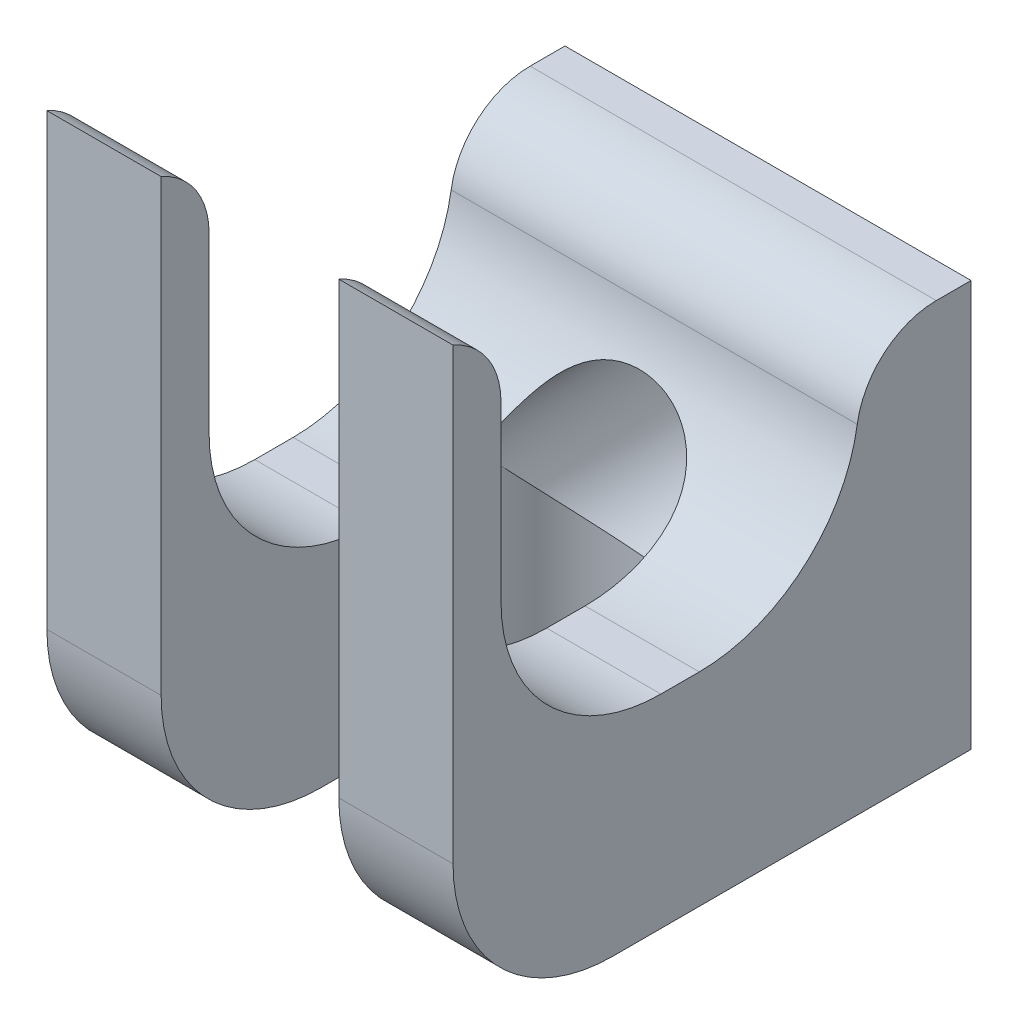
ISO-10303-21;
HEADER;
FILE_DESCRIPTION(('STEP AP214'),'2;1');
FILE_NAME('part.step','',(''),(''),'','','');
FILE_SCHEMA(('AUTOMOTIVE_DESIGN { 1 0 10303 214 1 1 1 1 }'));
ENDSEC;
DATA;
#1=APPLICATION_CONTEXT('core data for automotive mechanical design processes');
#2=APPLICATION_PROTOCOL_DEFINITION('international standard','automotive_design',2000,#1);
#3=PRODUCT_CONTEXT('',#1,'mechanical');
#4=PRODUCT('Part','Part','',(#3));
#5=PRODUCT_RELATED_PRODUCT_CATEGORY('part','',(#4));
#6=PRODUCT_DEFINITION_FORMATION('','',#4);
#7=PRODUCT_DEFINITION_CONTEXT('part definition',#1,'design');
#8=PRODUCT_DEFINITION('design','',#6,#7);
#9=PRODUCT_DEFINITION_SHAPE('','',#8);
#10=(LENGTH_UNIT() NAMED_UNIT(*) SI_UNIT(.MILLI.,.METRE.));
#11=(NAMED_UNIT(*) PLANE_ANGLE_UNIT() SI_UNIT($,.RADIAN.));
#12=(NAMED_UNIT(*) SI_UNIT($,.STERADIAN.) SOLID_ANGLE_UNIT());
#13=UNCERTAINTY_MEASURE_WITH_UNIT(LENGTH_MEASURE(1.E-05),#10,'distance_accuracy_value','');
#14=(GEOMETRIC_REPRESENTATION_CONTEXT(3) GLOBAL_UNCERTAINTY_ASSIGNED_CONTEXT((#13)) GLOBAL_UNIT_ASSIGNED_CONTEXT((#10,
#11,#12)) REPRESENTATION_CONTEXT('',''));
#15=CARTESIAN_POINT('',(0.,0.,0.));
#16=DIRECTION('',(0.,0.,1.));
#17=DIRECTION('',(1.,0.,0.));
#18=AXIS2_PLACEMENT_3D('',#15,#16,#17);
#19=CARTESIAN_POINT('',(12.7,0.,32.4));
#20=DIRECTION('',(0.,-1.,0.));
#21=DIRECTION('',(0.,0.,-1.));
#22=AXIS2_PLACEMENT_3D('',#19,#20,#21);
#23=PLANE('',#22);
#24=DIRECTION('',(0.,0.,-1.));
#25=VECTOR('',#24,1.);
#26=CARTESIAN_POINT('',(12.7,0.,32.4));
#27=LINE('',#26,#25);
#28=CARTESIAN_POINT('',(12.7,0.,19.4));
#29=VERTEX_POINT('',#28);
#30=CARTESIAN_POINT('',(12.7,0.,17.));
#31=VERTEX_POINT('',#30);
#32=EDGE_CURVE('E228',#29,#31,#27,.T.);
#33=ORIENTED_EDGE('',*,*,#32,.T.);
#34=DIRECTION('',(-1.,0.,0.));
#35=VECTOR('',#34,1.);
#36=CARTESIAN_POINT('',(12.7,0.,17.));
#37=LINE('',#36,#35);
#38=CARTESIAN_POINT('',(5.55625,0.,17.));
#39=VERTEX_POINT('',#38);
#40=EDGE_CURVE('E283',#31,#39,#37,.T.);
#41=ORIENTED_EDGE('',*,*,#40,.T.);
#42=DIRECTION('',(0.,0.,-1.));
#43=VECTOR('',#42,1.);
#44=CARTESIAN_POINT('',(5.55625,0.,32.4));
#45=LINE('',#44,#43);
#46=CARTESIAN_POINT('',(5.55625,0.,19.4));
#47=VERTEX_POINT('',#46);
#48=EDGE_CURVE('E225',#47,#39,#45,.T.);
#49=ORIENTED_EDGE('',*,*,#48,.F.);
#50=DIRECTION('',(-1.,0.,0.));
#51=VECTOR('',#50,1.);
#52=CARTESIAN_POINT('',(12.7,0.,19.4));
#53=LINE('',#52,#51);
#54=EDGE_CURVE('E281',#47,#29,#53,.F.);
#55=ORIENTED_EDGE('',*,*,#54,.T.);
#56=EDGE_LOOP('',(#33,#41,#49,#55));
#57=FACE_BOUND('',#56,.T.);
#58=ADVANCED_FACE('F33',(#57),#23,.F.);
#59=CARTESIAN_POINT('',(-12.7,0.,32.4));
#60=DIRECTION('',(0.,-1.,0.));
#61=DIRECTION('',(0.,0.,-1.));
#62=AXIS2_PLACEMENT_3D('',#59,#60,#61);
#63=PLANE('',#62);
#64=DIRECTION('',(0.,0.,-1.));
#65=VECTOR('',#64,1.);
#66=CARTESIAN_POINT('',(-5.55625,0.,32.4));
#67=LINE('',#66,#65);
#68=CARTESIAN_POINT('',(-5.55625,0.,19.4));
#69=VERTEX_POINT('',#68);
#70=CARTESIAN_POINT('',(-5.55625,0.,17.));
#71=VERTEX_POINT('',#70);
#72=EDGE_CURVE('E240',#69,#71,#67,.T.);
#73=ORIENTED_EDGE('',*,*,#72,.T.);
#74=DIRECTION('',(-1.,0.,0.));
#75=VECTOR('',#74,1.);
#76=CARTESIAN_POINT('',(-9.128125,0.,17.));
#77=LINE('',#76,#75);
#78=CARTESIAN_POINT('',(-12.7,0.,17.));
#79=VERTEX_POINT('',#78);
#80=EDGE_CURVE('E288',#71,#79,#77,.T.);
#81=ORIENTED_EDGE('',*,*,#80,.T.);
#82=DIRECTION('',(0.,0.,-1.));
#83=VECTOR('',#82,1.);
#84=CARTESIAN_POINT('',(-12.7,0.,32.4));
#85=LINE('',#84,#83);
#86=CARTESIAN_POINT('',(-12.7,0.,19.4));
#87=VERTEX_POINT('',#86);
#88=EDGE_CURVE('E237',#87,#79,#85,.T.);
#89=ORIENTED_EDGE('',*,*,#88,.F.);
#90=DIRECTION('',(-1.,0.,0.));
#91=VECTOR('',#90,1.);
#92=CARTESIAN_POINT('',(-5.55625,0.,19.4));
#93=LINE('',#92,#91);
#94=EDGE_CURVE('E286',#87,#69,#93,.F.);
#95=ORIENTED_EDGE('',*,*,#94,.T.);
#96=EDGE_LOOP('',(#73,#81,#89,#95));
#97=FACE_BOUND('',#96,.T.);
#98=ADVANCED_FACE('F484',(#97),#63,.F.);
#99=CARTESIAN_POINT('',(0.,0.,7.));
#100=DIRECTION('',(0.,0.,1.));
#101=DIRECTION('',(1.,0.,0.));
#102=AXIS2_PLACEMENT_3D('',#99,#100,#101);
#103=PLANE('',#102);
#104=DIRECTION('',(1.,0.,0.));
#105=VECTOR('',#104,1.);
#106=CARTESIAN_POINT('',(12.7,-12.7,7.));
#107=LINE('',#106,#105);
#108=CARTESIAN_POINT('',(-0.556249999999999,-12.7,7.));
#109=VERTEX_POINT('',#108);
#110=CARTESIAN_POINT('',(0.556249999999999,-12.7,7.));
#111=VERTEX_POINT('',#110);
#112=EDGE_CURVE('E259',#109,#111,#107,.T.);
#113=ORIENTED_EDGE('',*,*,#112,.T.);
#114=DIRECTION('',(0.,-1.,0.));
#115=VECTOR('',#114,1.);
#116=CARTESIAN_POINT('',(0.556249999999999,0.,7.));
#117=LINE('',#116,#115);
#118=CARTESIAN_POINT('',(0.556249999999999,-5.52833609687399,7.));
#119=VERTEX_POINT('',#118);
#120=EDGE_CURVE('E386',#111,#119,#117,.F.);
#121=ORIENTED_EDGE('',*,*,#120,.T.);
#122=CARTESIAN_POINT('',(0.,0.,7.));
#123=DIRECTION('',(0.,0.,1.));
#124=DIRECTION('',(1.,0.,0.));
#125=AXIS2_PLACEMENT_3D('',#122,#123,#124);
#126=CIRCLE('',#125,5.55625);
#127=CARTESIAN_POINT('',(-0.556249999999999,-5.52833609687399,7.));
#128=VERTEX_POINT('',#127);
#129=EDGE_CURVE('E246',#128,#119,#126,.T.);
#130=ORIENTED_EDGE('',*,*,#129,.F.);
#131=DIRECTION('',(0.,1.,0.));
#132=VECTOR('',#131,1.);
#133=CARTESIAN_POINT('',(-0.556249999999999,0.,7.));
#134=LINE('',#133,#132);
#135=EDGE_CURVE('E383',#128,#109,#134,.F.);
#136=ORIENTED_EDGE('',*,*,#135,.T.);
#137=EDGE_LOOP('',(#113,#121,#130,#136));
#138=FACE_BOUND('',#137,.T.);
#139=ADVANCED_FACE('F382',(#138),#103,.T.);
#140=CARTESIAN_POINT('',(-12.7,-12.7,7.));
#141=DIRECTION('',(1.,0.,0.));
#142=DIRECTION('',(0.,0.,-1.));
#143=AXIS2_PLACEMENT_3D('',#140,#141,#142);
#144=PLANE('',#143);
#145=CARTESIAN_POINT('',(-12.7,10.,17.));
#146=DIRECTION('',(1.,0.,0.));
#147=DIRECTION('',(0.,0.,-1.));
#148=AXIS2_PLACEMENT_3D('',#145,#146,#147);
#149=CIRCLE('',#148,10.);
#150=CARTESIAN_POINT('',(-12.7,8.46666666666667,7.11825476502815));
#151=VERTEX_POINT('',#150);
#152=EDGE_CURVE('E321',#79,#151,#149,.T.);
#153=ORIENTED_EDGE('',*,*,#152,.T.);
#154=CARTESIAN_POINT('',(-12.7,7.7,2.17738214754223));
#155=DIRECTION('',(1.,0.,0.));
#156=DIRECTION('',(0.,0.,-1.));
#157=AXIS2_PLACEMENT_3D('',#154,#155,#156);
#158=CIRCLE('',#157,5.);
#159=CARTESIAN_POINT('',(-12.7,12.7,2.17738214754223));
#160=VERTEX_POINT('',#159);
#161=EDGE_CURVE('E419',#151,#160,#158,.F.);
#162=ORIENTED_EDGE('',*,*,#161,.T.);
#163=DIRECTION('',(0.,0.,-1.));
#164=VECTOR('',#163,1.);
#165=CARTESIAN_POINT('',(-12.7,12.7,7.));
#166=LINE('',#165,#164);
#167=CARTESIAN_POINT('',(-12.7,12.7,0.));
#168=VERTEX_POINT('',#167);
#169=EDGE_CURVE('E262',#160,#168,#166,.T.);
#170=ORIENTED_EDGE('',*,*,#169,.T.);
#171=DIRECTION('',(0.,-1.,0.));
#172=VECTOR('',#171,1.);
#173=CARTESIAN_POINT('',(-12.7,-12.7,0.));
#174=LINE('',#173,#172);
#175=CARTESIAN_POINT('',(-12.7,-12.7,0.));
#176=VERTEX_POINT('',#175);
#177=EDGE_CURVE('E258',#168,#176,#174,.T.);
#178=ORIENTED_EDGE('',*,*,#177,.T.);
#179=DIRECTION('',(0.,0.,-1.));
#180=VECTOR('',#179,1.);
#181=CARTESIAN_POINT('',(-12.7,-12.7,7.));
#182=LINE('',#181,#180);
#183=CARTESIAN_POINT('',(-12.7,-12.7,22.4));
#184=VERTEX_POINT('',#183);
#185=EDGE_CURVE('E279',#184,#176,#182,.T.);
#186=ORIENTED_EDGE('',*,*,#185,.F.);
#187=CARTESIAN_POINT('',(-12.7,-2.7,22.4));
#188=DIRECTION('',(1.,0.,0.));
#189=DIRECTION('',(0.,0.,-1.));
#190=AXIS2_PLACEMENT_3D('',#187,#188,#189);
#191=CIRCLE('',#190,10.);
#192=CARTESIAN_POINT('',(-12.7,-2.7,32.4));
#193=VERTEX_POINT('',#192);
#194=EDGE_CURVE('E305',#184,#193,#191,.F.);
#195=ORIENTED_EDGE('',*,*,#194,.T.);
#196=DIRECTION('',(0.,-1.,0.));
#197=VECTOR('',#196,1.);
#198=CARTESIAN_POINT('',(-12.7,-12.7,32.4));
#199=LINE('',#198,#197);
#200=CARTESIAN_POINT('',(-12.7,25.4,32.4));
#201=VERTEX_POINT('',#200);
#202=EDGE_CURVE('E231',#201,#193,#199,.T.);
#203=ORIENTED_EDGE('',*,*,#202,.F.);
#204=CARTESIAN_POINT('',(-12.7,20.8174243050442,34.4));
#205=DIRECTION('',(1.,0.,0.));
#206=DIRECTION('',(0.,0.,-1.));
#207=AXIS2_PLACEMENT_3D('',#204,#205,#206);
#208=CIRCLE('',#207,5.);
#209=CARTESIAN_POINT('',(-12.7,20.8174243050442,29.4));
#210=VERTEX_POINT('',#209);
#211=EDGE_CURVE('E417',#201,#210,#208,.F.);
#212=ORIENTED_EDGE('',*,*,#211,.T.);
#213=DIRECTION('',(0.,-1.,0.));
#214=VECTOR('',#213,1.);
#215=CARTESIAN_POINT('',(-12.7,25.4,29.4));
#216=LINE('',#215,#214);
#217=CARTESIAN_POINT('',(-12.7,10.,29.4));
#218=VERTEX_POINT('',#217);
#219=EDGE_CURVE('E218',#210,#218,#216,.T.);
#220=ORIENTED_EDGE('',*,*,#219,.T.);
#221=CARTESIAN_POINT('',(-12.7,10.,19.4));
#222=DIRECTION('',(1.,0.,0.));
#223=DIRECTION('',(0.,0.,-1.));
#224=AXIS2_PLACEMENT_3D('',#221,#222,#223);
#225=CIRCLE('',#224,10.);
#226=EDGE_CURVE('E437',#218,#87,#225,.T.);
#227=ORIENTED_EDGE('',*,*,#226,.T.);
#228=ORIENTED_EDGE('',*,*,#88,.T.);
#229=EDGE_LOOP('',(#153,#162,#170,#178,#186,#195,#203,#212,#220,#227,#228));
#230=FACE_BOUND('',#229,.T.);
#231=ADVANCED_FACE('F335',(#230),#144,.F.);
#232=CARTESIAN_POINT('',(12.7,-12.7,7.));
#233=DIRECTION('',(0.,1.,0.));
#234=DIRECTION('',(-1.,0.,0.));
#235=AXIS2_PLACEMENT_3D('',#232,#233,#234);
#236=PLANE('',#235);
#237=DIRECTION('',(0.,0.,-1.));
#238=VECTOR('',#237,1.);
#239=CARTESIAN_POINT('',(-5.55625,-12.7,32.4));
#240=LINE('',#239,#238);
#241=CARTESIAN_POINT('',(-5.55625,-12.7,22.4));
#242=VERTEX_POINT('',#241);
#243=CARTESIAN_POINT('',(-5.55625,-12.7,12.));
#244=VERTEX_POINT('',#243);
#245=EDGE_CURVE('E243',#242,#244,#240,.T.);
#246=ORIENTED_EDGE('',*,*,#245,.F.);
#247=DIRECTION('',(1.,0.,0.));
#248=VECTOR('',#247,1.);
#249=CARTESIAN_POINT('',(12.7,-12.7,22.4));
#250=LINE('',#249,#248);
#251=EDGE_CURVE('E303',#242,#184,#250,.F.);
#252=ORIENTED_EDGE('',*,*,#251,.T.);
#253=ORIENTED_EDGE('',*,*,#185,.T.);
#254=DIRECTION('',(1.,0.,0.));
#255=VECTOR('',#254,1.);
#256=CARTESIAN_POINT('',(12.7,-12.7,0.));
#257=LINE('',#256,#255);
#258=CARTESIAN_POINT('',(12.7,-12.7,0.));
#259=VERTEX_POINT('',#258);
#260=EDGE_CURVE('E266',#176,#259,#257,.T.);
#261=ORIENTED_EDGE('',*,*,#260,.T.);
#262=DIRECTION('',(0.,0.,-1.));
#263=VECTOR('',#262,1.);
#264=CARTESIAN_POINT('',(12.7,-12.7,7.));
#265=LINE('',#264,#263);
#266=CARTESIAN_POINT('',(12.7,-12.7,22.4));
#267=VERTEX_POINT('',#266);
#268=EDGE_CURVE('E277',#267,#259,#265,.T.);
#269=ORIENTED_EDGE('',*,*,#268,.F.);
#270=DIRECTION('',(1.,0.,0.));
#271=VECTOR('',#270,1.);
#272=CARTESIAN_POINT('',(5.55625,-12.7,22.4));
#273=LINE('',#272,#271);
#274=CARTESIAN_POINT('',(5.55625,-12.7,22.4));
#275=VERTEX_POINT('',#274);
#276=EDGE_CURVE('E301',#267,#275,#273,.F.);
#277=ORIENTED_EDGE('',*,*,#276,.T.);
#278=DIRECTION('',(0.,0.,-1.));
#279=VECTOR('',#278,1.);
#280=CARTESIAN_POINT('',(5.55625,-12.7,32.4));
#281=LINE('',#280,#279);
#282=CARTESIAN_POINT('',(5.55625,-12.7,12.));
#283=VERTEX_POINT('',#282);
#284=EDGE_CURVE('E203',#275,#283,#281,.T.);
#285=ORIENTED_EDGE('',*,*,#284,.T.);
#286=CARTESIAN_POINT('',(0.556249999999999,-12.7,12.));
#287=DIRECTION('',(0.,1.,0.));
#288=DIRECTION('',(-1.,0.,0.));
#289=AXIS2_PLACEMENT_3D('',#286,#287,#288);
#290=CIRCLE('',#289,5.);
#291=EDGE_CURVE('E370',#283,#111,#290,.T.);
#292=ORIENTED_EDGE('',*,*,#291,.T.);
#293=ORIENTED_EDGE('',*,*,#112,.F.);
#294=CARTESIAN_POINT('',(-0.556249999999999,-12.7,12.));
#295=DIRECTION('',(0.,1.,0.));
#296=DIRECTION('',(-1.,0.,0.));
#297=AXIS2_PLACEMENT_3D('',#294,#295,#296);
#298=CIRCLE('',#297,5.);
#299=EDGE_CURVE('E11',#109,#244,#298,.T.);
#300=ORIENTED_EDGE('',*,*,#299,.T.);
#301=EDGE_LOOP('',(#246,#252,#253,#261,#269,#277,#285,#292,#293,#300));
#302=FACE_BOUND('',#301,.T.);
#303=ADVANCED_FACE('F401',(#302),#236,.F.);
#304=CARTESIAN_POINT('',(12.7,-12.7,7.));
#305=DIRECTION('',(-1.,0.,0.));
#306=DIRECTION('',(0.,-1.,0.));
#307=AXIS2_PLACEMENT_3D('',#304,#305,#306);
#308=PLANE('',#307);
#309=DIRECTION('',(0.,0.,-1.));
#310=VECTOR('',#309,1.);
#311=CARTESIAN_POINT('',(12.7,12.7,7.));
#312=LINE('',#311,#310);
#313=CARTESIAN_POINT('',(12.7,12.7,2.17738214754223));
#314=VERTEX_POINT('',#313);
#315=CARTESIAN_POINT('',(12.7,12.7,0.));
#316=VERTEX_POINT('',#315);
#317=EDGE_CURVE('E275',#314,#316,#312,.T.);
#318=ORIENTED_EDGE('',*,*,#317,.F.);
#319=CARTESIAN_POINT('',(12.7,7.7,2.17738214754223));
#320=DIRECTION('',(-1.,0.,0.));
#321=DIRECTION('',(0.,-1.,0.));
#322=AXIS2_PLACEMENT_3D('',#319,#320,#321);
#323=CIRCLE('',#322,5.);
#324=CARTESIAN_POINT('',(12.7,8.46666666666667,7.11825476502815));
#325=VERTEX_POINT('',#324);
#326=EDGE_CURVE('E191',#314,#325,#323,.F.);
#327=ORIENTED_EDGE('',*,*,#326,.T.);
#328=CARTESIAN_POINT('',(12.7,10.,17.));
#329=DIRECTION('',(-1.,0.,0.));
#330=DIRECTION('',(0.,-1.,0.));
#331=AXIS2_PLACEMENT_3D('',#328,#329,#330);
#332=CIRCLE('',#331,10.);
#333=EDGE_CURVE('E431',#325,#31,#332,.T.);
#334=ORIENTED_EDGE('',*,*,#333,.T.);
#335=ORIENTED_EDGE('',*,*,#32,.F.);
#336=CARTESIAN_POINT('',(12.7,10.,19.4));
#337=DIRECTION('',(-1.,0.,0.));
#338=DIRECTION('',(0.,-1.,0.));
#339=AXIS2_PLACEMENT_3D('',#336,#337,#338);
#340=CIRCLE('',#339,10.);
#341=CARTESIAN_POINT('',(12.7,10.,29.4));
#342=VERTEX_POINT('',#341);
#343=EDGE_CURVE('E406',#29,#342,#340,.T.);
#344=ORIENTED_EDGE('',*,*,#343,.T.);
#345=DIRECTION('',(0.,-1.,0.));
#346=VECTOR('',#345,1.);
#347=CARTESIAN_POINT('',(12.7,25.4,29.4));
#348=LINE('',#347,#346);
#349=CARTESIAN_POINT('',(12.7,20.8174243050442,29.4));
#350=VERTEX_POINT('',#349);
#351=EDGE_CURVE('E211',#350,#342,#348,.T.);
#352=ORIENTED_EDGE('',*,*,#351,.F.);
#353=CARTESIAN_POINT('',(12.7,20.8174243050442,34.4));
#354=DIRECTION('',(-1.,0.,0.));
#355=DIRECTION('',(0.,-1.,0.));
#356=AXIS2_PLACEMENT_3D('',#353,#354,#355);
#357=CIRCLE('',#356,5.);
#358=CARTESIAN_POINT('',(12.7,25.4,32.4));
#359=VERTEX_POINT('',#358);
#360=EDGE_CURVE('E423',#350,#359,#357,.F.);
#361=ORIENTED_EDGE('',*,*,#360,.T.);
#362=DIRECTION('',(0.,1.,0.));
#363=VECTOR('',#362,1.);
#364=CARTESIAN_POINT('',(12.7,-12.7,32.4));
#365=LINE('',#364,#363);
#366=CARTESIAN_POINT('',(12.7,-2.7,32.4));
#367=VERTEX_POINT('',#366);
#368=EDGE_CURVE('E204',#367,#359,#365,.T.);
#369=ORIENTED_EDGE('',*,*,#368,.F.);
#370=CARTESIAN_POINT('',(12.7,-2.7,22.4));
#371=DIRECTION('',(-1.,0.,0.));
#372=DIRECTION('',(0.,-1.,0.));
#373=AXIS2_PLACEMENT_3D('',#370,#371,#372);
#374=CIRCLE('',#373,10.);
#375=EDGE_CURVE('E309',#367,#267,#374,.F.);
#376=ORIENTED_EDGE('',*,*,#375,.T.);
#377=ORIENTED_EDGE('',*,*,#268,.T.);
#378=DIRECTION('',(0.,1.,0.));
#379=VECTOR('',#378,1.);
#380=CARTESIAN_POINT('',(12.7,-12.7,0.));
#381=LINE('',#380,#379);
#382=EDGE_CURVE('E269',#259,#316,#381,.T.);
#383=ORIENTED_EDGE('',*,*,#382,.T.);
#384=EDGE_LOOP('',(#318,#327,#334,#335,#344,#352,#361,#369,#376,#377,#383));
#385=FACE_BOUND('',#384,.T.);
#386=ADVANCED_FACE('F429',(#385),#308,.F.);
#387=CARTESIAN_POINT('',(12.7,12.7,7.));
#388=DIRECTION('',(0.,-1.,0.));
#389=DIRECTION('',(1.,0.,0.));
#390=AXIS2_PLACEMENT_3D('',#387,#388,#389);
#391=PLANE('',#390);
#392=ORIENTED_EDGE('',*,*,#169,.F.);
#393=DIRECTION('',(-1.,0.,0.));
#394=VECTOR('',#393,1.);
#395=CARTESIAN_POINT('',(12.7,12.7,2.17738214754223));
#396=LINE('',#395,#394);
#397=EDGE_CURVE('E421',#160,#314,#396,.F.);
#398=ORIENTED_EDGE('',*,*,#397,.T.);
#399=ORIENTED_EDGE('',*,*,#317,.T.);
#400=DIRECTION('',(-1.,0.,0.));
#401=VECTOR('',#400,1.);
#402=CARTESIAN_POINT('',(12.7,12.7,0.));
#403=LINE('',#402,#401);
#404=EDGE_CURVE('E263',#316,#168,#403,.T.);
#405=ORIENTED_EDGE('',*,*,#404,.T.);
#406=EDGE_LOOP('',(#392,#398,#399,#405));
#407=FACE_BOUND('',#406,.T.);
#408=ADVANCED_FACE('F441',(#407),#391,.F.);
#409=CARTESIAN_POINT('',(0.,0.,0.));
#410=DIRECTION('',(0.,0.,1.));
#411=DIRECTION('',(1.,0.,0.));
#412=AXIS2_PLACEMENT_3D('',#409,#410,#411);
#413=PLANE('',#412);
#414=CARTESIAN_POINT('',(0.,0.,0.));
#415=DIRECTION('',(0.,0.,1.));
#416=DIRECTION('',(1.,0.,0.));
#417=AXIS2_PLACEMENT_3D('',#414,#415,#416);
#418=CIRCLE('',#417,3.3782);
#419=CARTESIAN_POINT('',(3.3782,0.,0.));
#420=VERTEX_POINT('',#419);
#421=EDGE_CURVE('E255',#420,#420,#418,.T.);
#422=ORIENTED_EDGE('',*,*,#421,.T.);
#423=EDGE_LOOP('',(#422));
#424=FACE_BOUND('',#423,.T.);
#425=ORIENTED_EDGE('',*,*,#177,.F.);
#426=ORIENTED_EDGE('',*,*,#404,.F.);
#427=ORIENTED_EDGE('',*,*,#382,.F.);
#428=ORIENTED_EDGE('',*,*,#260,.F.);
#429=EDGE_LOOP('',(#425,#426,#427,#428));
#430=FACE_BOUND('',#429,.T.);
#431=ADVANCED_FACE('F447',(#424,#430),#413,.F.);
#432=CARTESIAN_POINT('',(0.,0.,7.));
#433=DIRECTION('',(0.,0.,1.));
#434=DIRECTION('',(1.,0.,0.));
#435=AXIS2_PLACEMENT_3D('',#432,#433,#434);
#436=CYLINDRICAL_SURFACE('',#435,3.3782);
#437=ORIENTED_EDGE('',*,*,#421,.F.);
#438=EDGE_LOOP('',(#437));
#439=FACE_BOUND('',#438,.T.);
#440=CARTESIAN_POINT('',(0.,0.,0.65));
#441=DIRECTION('',(0.,0.,1.));
#442=DIRECTION('',(1.,0.,0.));
#443=AXIS2_PLACEMENT_3D('',#440,#441,#442);
#444=CIRCLE('',#443,3.3782);
#445=CARTESIAN_POINT('',(3.3782,0.,0.65));
#446=VERTEX_POINT('',#445);
#447=EDGE_CURVE('E252',#446,#446,#444,.T.);
#448=ORIENTED_EDGE('',*,*,#447,.T.);
#449=EDGE_LOOP('',(#448));
#450=FACE_BOUND('',#449,.T.);
#451=ADVANCED_FACE('F504',(#439,#450),#436,.F.);
#452=CARTESIAN_POINT('',(3.3782,0.,0.65));
#453=DIRECTION('',(0.,0.,-1.));
#454=DIRECTION('',(-1.,0.,0.));
#455=AXIS2_PLACEMENT_3D('',#452,#453,#454);
#456=PLANE('',#455);
#457=ORIENTED_EDGE('',*,*,#447,.F.);
#458=EDGE_LOOP('',(#457));
#459=FACE_BOUND('',#458,.T.);
#460=CARTESIAN_POINT('',(0.,0.,0.65));
#461=DIRECTION('',(0.,0.,1.));
#462=DIRECTION('',(1.,0.,0.));
#463=AXIS2_PLACEMENT_3D('',#460,#461,#462);
#464=CIRCLE('',#463,5.55625);
#465=CARTESIAN_POINT('',(5.55625,0.,0.65));
#466=VERTEX_POINT('',#465);
#467=EDGE_CURVE('E249',#466,#466,#464,.T.);
#468=ORIENTED_EDGE('',*,*,#467,.T.);
#469=EDGE_LOOP('',(#468));
#470=FACE_BOUND('',#469,.T.);
#471=ADVANCED_FACE('F499',(#459,#470),#456,.F.);
#472=CARTESIAN_POINT('',(0.,0.,7.));
#473=DIRECTION('',(0.,0.,1.));
#474=DIRECTION('',(1.,0.,0.));
#475=AXIS2_PLACEMENT_3D('',#472,#473,#474);
#476=CYLINDRICAL_SURFACE('',#475,5.55625);
#477=ORIENTED_EDGE('',*,*,#467,.F.);
#478=EDGE_LOOP('',(#477));
#479=FACE_BOUND('',#478,.T.);
#480=DIRECTION('',(0.,0.,1.));
#481=VECTOR('',#480,1.);
#482=CARTESIAN_POINT('',(-5.55625,0.,12.));
#483=LINE('',#482,#481);
#484=CARTESIAN_POINT('',(-5.55625,0.,12.));
#485=VERTEX_POINT('',#484);
#486=EDGE_CURVE('E380',#485,#71,#483,.T.);
#487=ORIENTED_EDGE('',*,*,#486,.F.);
#488=CARTESIAN_POINT('',(-0.556249999999999,-5.52833609687399,7.));
#489=CARTESIAN_POINT('',(-0.676260402474289,-5.51629208184569,6.9999708779391));
#490=CARTESIAN_POINT('',(-0.795838250775723,-5.50028348181071,7.00431917985025));
#491=CARTESIAN_POINT('',(-1.03301284659928,-5.46069093260622,7.0213717573716));
#492=CARTESIAN_POINT('',(-1.15061143595877,-5.4371144888929,7.03406776711442));
#493=CARTESIAN_POINT('',(-1.38191606589751,-5.38295766062149,7.06726956863959));
#494=CARTESIAN_POINT('',(-1.49564747835128,-5.35244165705263,7.08770465457922));
#495=CARTESIAN_POINT('',(-1.71954670155006,-5.28476580708123,7.13586055627656));
#496=CARTESIAN_POINT('',(-1.82971376931914,-5.24760458590803,7.16358288018571));
#497=CARTESIAN_POINT('',(-2.04539807160006,-5.16734451014735,7.22559114027541));
#498=CARTESIAN_POINT('',(-2.15093248153571,-5.12427056293553,7.25984976664964));
#499=CARTESIAN_POINT('',(-2.35740637395545,-5.03262546988166,7.33439250343544));
#500=CARTESIAN_POINT('',(-2.45834416089761,-4.98405231823088,7.37467881415031));
#501=CARTESIAN_POINT('',(-2.75410971082539,-4.83074951161823,7.50380930236469));
#502=CARTESIAN_POINT('',(-2.94155911983538,-4.71856207002926,7.60082694249052));
#503=CARTESIAN_POINT('',(-3.37848413819356,-4.42226924182363,7.86155766205192));
#504=CARTESIAN_POINT('',(-3.61586998525263,-4.22909613393194,8.03522179567059));
#505=CARTESIAN_POINT('',(-3.93839182618961,-3.92213439108495,8.31469736695583));
#506=CARTESIAN_POINT('',(-4.04043000403234,-3.81678117541343,8.41117314217653));
#507=CARTESIAN_POINT('',(-4.23365628718549,-3.60124769414258,8.60945139830672));
#508=CARTESIAN_POINT('',(-4.32484699000938,-3.49106859282063,8.71125259556152));
#509=CARTESIAN_POINT('',(-4.52955336017809,-3.2238537553792,8.95900403062208));
#510=CARTESIAN_POINT('',(-4.63827928083318,-3.06500521007304,9.10695616974717));
#511=CARTESIAN_POINT('',(-4.83653884862723,-2.74149783987819,9.40928275726777));
#512=CARTESIAN_POINT('',(-4.92606424843356,-2.57683655342734,9.56365993159297));
#513=CARTESIAN_POINT('',(-5.08668603764771,-2.24317257089372,9.87722339463873));
#514=CARTESIAN_POINT('',(-5.15778086215974,-2.07416950749927,10.0364100904438));
#515=CARTESIAN_POINT('',(-5.28216948201874,-1.73307267897919,10.3582230652695));
#516=CARTESIAN_POINT('',(-5.33546869686305,-1.56097987166305,10.5208482810468));
#517=CARTESIAN_POINT('',(-5.4387579746313,-1.16056790829663,10.8996447303833));
#518=CARTESIAN_POINT('',(-5.48252571396002,-0.931460445576571,11.1166897538144));
#519=CARTESIAN_POINT('',(-5.54101797652005,-0.47180039637602,11.5524409139821));
#520=CARTESIAN_POINT('',(-5.55579108508861,-0.241250877919859,11.7711436543854));
#521=CARTESIAN_POINT('',(-5.55624648832329,-0.00721047581470798,11.9931599694804));
#522=CARTESIAN_POINT('',(-5.55624999714813,-0.00360522193983052,11.9965799999106));
#523=CARTESIAN_POINT('',(-5.55625,0.,12.));
#524=B_SPLINE_CURVE_WITH_KNOTS('',3,(#488,#489,#490,#491,#492,#493,#494,#495,#496,#497,#498,
#499,#500,#501,#502,#503,#504,#505,#506,#507,#508,#509,#510,#511,#512,#513,#514,#515,#516,#517,
#518,#519,#520,#521,#522,#523),.UNSPECIFIED.,.F.,.F.,(4,2,2,2,2,2,2,2,2,2,2,2,2,2,2,2,2,4),(0.,
0.361645283504886,0.722933005481906,1.08099658387767,1.43913432478157,1.7958072353674,
2.15261066239831,2.86730658179842,3.91687115741473,4.44318489719071,4.96937235219932,
5.69668529210027,6.42431001683776,7.15199650221956,7.87946117447641,8.83392485052118,
9.78678779343696,9.80169584866981),.UNSPECIFIED.);
#525=EDGE_CURVE('E41',#485,#128,#524,.F.);
#526=ORIENTED_EDGE('',*,*,#525,.T.);
#527=ORIENTED_EDGE('',*,*,#129,.T.);
#528=CARTESIAN_POINT('',(0.556249999999999,-5.52833609687399,7.));
#529=CARTESIAN_POINT('',(0.676260402474289,-5.51629208184569,6.9999708779391));
#530=CARTESIAN_POINT('',(0.795838250775723,-5.50028348181071,7.00431917985025));
#531=CARTESIAN_POINT('',(1.03301284659928,-5.46069093260622,7.0213717573716));
#532=CARTESIAN_POINT('',(1.15061143595877,-5.4371144888929,7.03406776711442));
#533=CARTESIAN_POINT('',(1.38191606589751,-5.38295766062149,7.06726956863959));
#534=CARTESIAN_POINT('',(1.49564747835128,-5.35244165705263,7.08770465457922));
#535=CARTESIAN_POINT('',(1.71954670155006,-5.28476580708123,7.13586055627656));
#536=CARTESIAN_POINT('',(1.82971376931914,-5.24760458590803,7.16358288018571));
#537=CARTESIAN_POINT('',(2.04539807160006,-5.16734451014735,7.22559114027541));
#538=CARTESIAN_POINT('',(2.15093248153571,-5.12427056293553,7.25984976664964));
#539=CARTESIAN_POINT('',(2.35740637395545,-5.03262546988166,7.33439250343544));
#540=CARTESIAN_POINT('',(2.45834416089761,-4.98405231823088,7.37467881415031));
#541=CARTESIAN_POINT('',(2.75410971082539,-4.83074951161823,7.50380930236469));
#542=CARTESIAN_POINT('',(2.94155911983538,-4.71856207002926,7.60082694249052));
#543=CARTESIAN_POINT('',(3.37848413819356,-4.42226924182363,7.86155766205192));
#544=CARTESIAN_POINT('',(3.61586998525263,-4.22909613393194,8.03522179567059));
#545=CARTESIAN_POINT('',(3.93839182618961,-3.92213439108495,8.31469736695583));
#546=CARTESIAN_POINT('',(4.04043000403234,-3.81678117541343,8.41117314217653));
#547=CARTESIAN_POINT('',(4.23365628718549,-3.60124769414258,8.60945139830672));
#548=CARTESIAN_POINT('',(4.32484699000938,-3.49106859282063,8.71125259556152));
#549=CARTESIAN_POINT('',(4.52955336017809,-3.2238537553792,8.95900403062208));
#550=CARTESIAN_POINT('',(4.63827928083318,-3.06500521007304,9.10695616974717));
#551=CARTESIAN_POINT('',(4.83653884862723,-2.74149783987819,9.40928275726777));
#552=CARTESIAN_POINT('',(4.92606424843356,-2.57683655342734,9.56365993159297));
#553=CARTESIAN_POINT('',(5.08668603764771,-2.24317257089372,9.87722339463873));
#554=CARTESIAN_POINT('',(5.15778086215974,-2.07416950749927,10.0364100904438));
#555=CARTESIAN_POINT('',(5.28216948201874,-1.73307267897919,10.3582230652695));
#556=CARTESIAN_POINT('',(5.33546869686305,-1.56097987166305,10.5208482810468));
#557=CARTESIAN_POINT('',(5.4387579746313,-1.16056790829663,10.8996447303833));
#558=CARTESIAN_POINT('',(5.48252571396002,-0.931460445576571,11.1166897538144));
#559=CARTESIAN_POINT('',(5.54101797652005,-0.47180039637602,11.5524409139821));
#560=CARTESIAN_POINT('',(5.55579108508861,-0.241250877919859,11.7711436543854));
#561=CARTESIAN_POINT('',(5.55624648832329,-0.00721047581470798,11.9931599694804));
#562=CARTESIAN_POINT('',(5.55624999714813,-0.00360522193983052,11.9965799999106));
#563=CARTESIAN_POINT('',(5.55625,0.,12.));
#564=B_SPLINE_CURVE_WITH_KNOTS('',3,(#528,#529,#530,#531,#532,#533,#534,#535,#536,#537,#538,
#539,#540,#541,#542,#543,#544,#545,#546,#547,#548,#549,#550,#551,#552,#553,#554,#555,#556,#557,
#558,#559,#560,#561,#562,#563),.UNSPECIFIED.,.F.,.F.,(4,2,2,2,2,2,2,2,2,2,2,2,2,2,2,2,2,4),(0.,
0.361645283504886,0.722933005481906,1.08099658387767,1.43913432478157,1.7958072353674,
2.15261066239831,2.86730658179842,3.91687115741473,4.44318489719071,4.96937235219932,
5.69668529210027,6.42431001683776,7.15199650221956,7.87946117447641,8.83392485052118,
9.78678779343696,9.80169584866981),.UNSPECIFIED.);
#565=CARTESIAN_POINT('',(5.55625,0.,12.));
#566=VERTEX_POINT('',#565);
#567=EDGE_CURVE('E364',#119,#566,#564,.T.);
#568=ORIENTED_EDGE('',*,*,#567,.T.);
#569=DIRECTION('',(0.,0.,1.));
#570=VECTOR('',#569,1.);
#571=CARTESIAN_POINT('',(5.55625,0.,12.));
#572=LINE('',#571,#570);
#573=EDGE_CURVE('E403',#566,#39,#572,.T.);
#574=ORIENTED_EDGE('',*,*,#573,.T.);
#575=CARTESIAN_POINT('',(5.55625,0.,17.));
#576=CARTESIAN_POINT('',(5.55624638609275,2.9290704938886E-08,16.8831016186146));
#577=CARTESIAN_POINT('',(5.55625045783758,0.00204999308631205,16.7662129238539));
#578=CARTESIAN_POINT('',(5.55624273931147,0.0102460791857534,16.5325797619591));
#579=CARTESIAN_POINT('',(5.55623094911174,0.0163921830996338,16.4158352941799));
#580=CARTESIAN_POINT('',(5.55612495282048,0.0409653373922494,16.0660584463783));
#581=CARTESIAN_POINT('',(5.55596014854247,0.0655272342431381,15.8334278609934));
#582=CARTESIAN_POINT('',(5.55479973735206,0.131122194724224,15.3688393018968));
#583=CARTESIAN_POINT('',(5.55379825700349,0.172270635514482,15.1368977493641));
#584=CARTESIAN_POINT('',(5.54986406224928,0.270831330962848,14.6764879493696));
#585=CARTESIAN_POINT('',(5.54693114141549,0.328245323673901,14.4480200758376));
#586=CARTESIAN_POINT('',(5.53673100039491,0.471920482274777,13.9512205657941));
#587=CARTESIAN_POINT('',(5.52872432647416,0.561635224848051,13.6838932434921));
#588=CARTESIAN_POINT('',(5.50451788061114,0.763212934747906,13.1579852336206));
#589=CARTESIAN_POINT('',(5.48831563037916,0.875082595349534,12.899407217034));
#590=CARTESIAN_POINT('',(5.44374632741,1.11932904321449,12.3943427956529));
#591=CARTESIAN_POINT('',(5.41542410472799,1.25162911985299,12.1478155247887));
#592=CARTESIAN_POINT('',(5.34196664318476,1.53516125320998,11.6685989300141));
#593=CARTESIAN_POINT('',(5.29684365259954,1.68637946483056,11.4358996680203));
#594=CARTESIAN_POINT('',(5.2061182367345,1.94399528351452,11.0729610291314));
#595=CARTESIAN_POINT('',(5.16726841772127,2.04547846041989,10.9375059441719));
#596=CARTESIAN_POINT('',(5.07997805423324,2.25354421919659,10.6738173222824));
#597=CARTESIAN_POINT('',(5.03154056427301,2.36012516879991,10.5455815020522));
#598=CARTESIAN_POINT('',(4.92393240109406,2.57710222060092,10.2971816571502));
#599=CARTESIAN_POINT('',(4.86476701607362,2.6874964214905,10.1770136953307));
#600=CARTESIAN_POINT('',(4.73465849146094,2.91060023531294,9.94548004118242));
#601=CARTESIAN_POINT('',(4.66371505198783,3.02330990713595,9.83411457308047));
#602=CARTESIAN_POINT('',(4.50847870311782,3.25032697470701,9.61985648535795));
#603=CARTESIAN_POINT('',(4.42405837705676,3.36463901995869,9.51706064353362));
#604=CARTESIAN_POINT('',(4.24191529314199,3.59154934727799,9.32183853591476));
#605=CARTESIAN_POINT('',(4.14419235601765,3.70414760622728,9.22941240989675));
#606=CARTESIAN_POINT('',(3.9354464755231,3.92520968065143,9.05539752249396));
#607=CARTESIAN_POINT('',(3.82442997964913,4.03367546703365,8.97380354758568));
#608=CARTESIAN_POINT('',(3.58947607767009,4.24410522777443,8.82158061082914));
#609=CARTESIAN_POINT('',(3.46554088590488,4.34607031157835,8.75094977498397));
#610=CARTESIAN_POINT('',(3.22493462591552,4.52668410504754,8.63024447184794));
#611=CARTESIAN_POINT('',(3.10991845949229,4.60654660129003,8.57867496088611));
#612=CARTESIAN_POINT('',(2.87189367276407,4.75857912482821,8.48321861627036));
#613=CARTESIAN_POINT('',(2.74888567893999,4.8307497539226,8.43933118141095));
#614=CARTESIAN_POINT('',(2.49580081968588,4.96623548545879,8.35896861793394));
#615=CARTESIAN_POINT('',(2.36572487588662,5.02955173864433,8.32249252583432));
#616=CARTESIAN_POINT('',(2.09951321787952,5.14636615686081,8.25661740484218));
#617=CARTESIAN_POINT('',(1.96337761787828,5.1998645068329,8.22721824263733));
#618=CARTESIAN_POINT('',(1.6953929833967,5.29304493714156,8.17689466684805));
#619=CARTESIAN_POINT('',(1.56386190800921,5.33340969578488,8.15553636628899));
#620=CARTESIAN_POINT('',(1.29737904765168,5.40441859697538,8.11843262647058));
#621=CARTESIAN_POINT('',(1.16242617074116,5.43505959329138,8.10268900369895));
#622=CARTESIAN_POINT('',(0.890162296977254,5.48622864735638,8.07662097529765));
#623=CARTESIAN_POINT('',(0.752852315517278,5.50676095193969,8.06629429379872));
#624=CARTESIAN_POINT('',(0.476741124409924,5.53750254658938,8.05089877553735));
#625=CARTESIAN_POINT('',(0.337939409769972,5.54770822195106,8.04583177984471));
#626=CARTESIAN_POINT('',(0.0595212477396367,5.55768152345152,8.04087962144598));
#627=CARTESIAN_POINT('',(-0.0800963693087213,5.55742296132323,8.04100745956575));
#628=CARTESIAN_POINT('',(-0.358814164713126,5.54640582847377,8.04647909861529));
#629=CARTESIAN_POINT('',(-0.497914343393651,5.53564726433815,8.05182289627364));
#630=CARTESIAN_POINT('',(-0.774639421626019,5.50374869586904,8.06780867110488));
#631=CARTESIAN_POINT('',(-0.912264034260104,5.48260670863213,8.07845166026009));
#632=CARTESIAN_POINT('',(-1.18498282855075,5.43019365832928,8.10518499495284));
#633=CARTESIAN_POINT('',(-1.3200778865716,5.39892617459314,8.12127341563889));
#634=CARTESIAN_POINT('',(-1.58712456849136,5.3265495831761,8.15915548114649));
#635=CARTESIAN_POINT('',(-1.71906833905596,5.28541824035071,8.18096202631182));
#636=CARTESIAN_POINT('',(-1.97849347740121,5.19388005994583,8.23051219261899));
#637=CARTESIAN_POINT('',(-2.10597649423049,5.14347669409594,8.25825359220092));
#638=CARTESIAN_POINT('',(-2.35561664745442,5.03403984424195,8.31995491996405));
#639=CARTESIAN_POINT('',(-2.47777398974547,4.97500669425953,8.353914607475));
#640=CARTESIAN_POINT('',(-2.7159183736799,4.84910730569558,8.42832293291592));
#641=CARTESIAN_POINT('',(-2.83190547353346,4.7822411410299,8.46877150961514));
#642=CARTESIAN_POINT('',(-3.05620700984623,4.64207784737737,8.55610046463853));
#643=CARTESIAN_POINT('',(-3.16456708857811,4.56882614106687,8.60293656863348));
#644=CARTESIAN_POINT('',(-3.37382264683988,4.41655731863484,8.70340528008614));
#645=CARTESIAN_POINT('',(-3.47471821996452,4.33754027482748,8.75703780230314));
#646=CARTESIAN_POINT('',(-3.66855618228156,4.17487930271562,8.87117255702647));
#647=CARTESIAN_POINT('',(-3.76149931829406,4.09123581010216,8.93167414320875));
#648=CARTESIAN_POINT('',(-3.93913748349895,3.92049615612901,9.05953359894412));
#649=CARTESIAN_POINT('',(-4.02383186172554,3.83339972303613,9.12689200875949));
#650=CARTESIAN_POINT('',(-4.1867020362898,3.65491097372649,9.26997889839902));
#651=CARTESIAN_POINT('',(-4.26468100487813,3.56346587154359,9.3458653142515));
#652=CARTESIAN_POINT('',(-4.41190992768163,3.37947486275919,9.50444150955884));
#653=CARTESIAN_POINT('',(-4.48115994851287,3.28692896456444,9.58713123708541));
#654=CARTESIAN_POINT('',(-4.61118254772014,3.10188658938166,9.75900722492056));
#655=CARTESIAN_POINT('',(-4.67195347842722,3.0093901254688,9.84819474277793));
#656=CARTESIAN_POINT('',(-4.78540137894162,2.82551307474823,10.0326681497978));
#657=CARTESIAN_POINT('',(-4.83807687227742,2.7341326942863,10.1279551469244));
#658=CARTESIAN_POINT('',(-4.95531888096312,2.51741283821615,10.3633110702163));
#659=CARTESIAN_POINT('',(-5.01626177962604,2.39304845917411,10.5060967026458));
#660=CARTESIAN_POINT('',(-5.12496266342153,2.15043292321887,10.8015421202514));
#661=CARTESIAN_POINT('',(-5.17271628438237,2.03218380026355,10.9542051531652));
#662=CARTESIAN_POINT('',(-5.25693527418547,1.80318120062019,11.2685041779678));
#663=CARTESIAN_POINT('',(-5.29337714626534,1.6924436947886,11.4301580355988));
#664=CARTESIAN_POINT('',(-5.35668058230759,1.47992555043789,11.7610102429741));
#665=CARTESIAN_POINT('',(-5.38354193957592,1.37814510519783,11.9302087554012));
#666=CARTESIAN_POINT('',(-5.43658657527122,1.15433214692374,12.3286724044973));
#667=CARTESIAN_POINT('',(-5.45997469186676,1.03581144870224,12.5602889498071));
#668=CARTESIAN_POINT('',(-5.49698580544159,0.816935949107448,13.0327363843638));
#669=CARTESIAN_POINT('',(-5.5106053345286,0.716587608443363,13.2735705139658));
#670=CARTESIAN_POINT('',(-5.53119424593905,0.534938769476267,13.7626132301331));
#671=CARTESIAN_POINT('',(-5.53816258331352,0.453641265706936,14.0108229691444));
#672=CARTESIAN_POINT('',(-5.54801842456448,0.310719188658686,14.5128487643397));
#673=CARTESIAN_POINT('',(-5.55090719177047,0.249088529682632,14.7666630602091));
#674=CARTESIAN_POINT('',(-5.55390598345573,0.164623979699737,15.1853363823615));
#675=CARTESIAN_POINT('',(-5.55464422860395,0.135829510852978,15.3490151086588));
#676=CARTESIAN_POINT('',(-5.55563279287124,0.086433295963696,15.6775842253504));
#677=CARTESIAN_POINT('',(-5.55588320084344,0.0658300585401159,15.8424743896046));
#678=CARTESIAN_POINT('',(-5.55617808062914,0.0329132775279416,16.1725864552327));
#679=CARTESIAN_POINT('',(-5.5562231577201,0.0205754608406803,16.3378059433766));
#680=CARTESIAN_POINT('',(-5.55624940886869,0.00411638280247489,16.6686830774554));
#681=CARTESIAN_POINT('',(-5.55623057157292,-3.41853927886946E-06,16.8343407960125));
#682=CARTESIAN_POINT('',(-5.55625,0.,17.));
#683=B_SPLINE_CURVE_WITH_KNOTS('',3,(#575,#576,#577,#578,#579,#580,#581,#582,#583,#584,#585,
#586,#587,#588,#589,#590,#591,#592,#593,#594,#595,#596,#597,#598,#599,#600,#601,#602,#603,#604,
#605,#606,#607,#608,#609,#610,#611,#612,#613,#614,#615,#616,#617,#618,#619,#620,#621,#622,#623,
#624,#625,#626,#627,#628,#629,#630,#631,#632,#633,#634,#635,#636,#637,#638,#639,#640,#641,#642,
#643,#644,#645,#646,#647,#648,#649,#650,#651,#652,#653,#654,#655,#656,#657,#658,#659,#660,#661,
#662,#663,#664,#665,#666,#667,#668,#669,#670,#671,#672,#673,#674,#675,#676,#677,#678,#679,#680,
#681,#682),.UNSPECIFIED.,.F.,.F.,(4,2,2,2,2,2,2,2,2,2,2,2,2,2,2,2,2,2,2,2,2,2,2,2,2,2,2,2,2,2,2,
2,2,2,2,2,2,2,2,2,2,2,2,2,2,2,2,2,2,2,2,2,2,4),(0.,0.350657819984586,0.701314065673007,
1.40246264042194,2.1085750208765,2.81476288133328,3.65994102685376,4.50537490174889,
5.34770830533356,6.18942882055682,6.70997508619223,7.23035577831328,7.75048064841564,
8.27061876344132,8.79600259007556,9.32139349766653,9.8465306102436,10.371577858808,
10.8186453854677,11.2656779086024,11.712652279823,12.1596182304632,12.576828946791,
12.9941745189608,13.4113446071807,13.8286606699997,14.2470211910246,14.6653814496566,
15.0838216328702,15.5021140600236,15.9213584163534,16.3404461130888,16.7595175930418,
17.178585118766,17.5948830390201,18.0111757385795,18.4274293007319,18.8437156857231,
19.269660343041,19.6956017495111,20.1216258105922,20.5477274793173,21.1435910375234,
21.7396515241746,22.3369419877479,22.9342453367367,23.7168360921542,24.499704533467,
25.2826959486817,26.0654448400063,26.5638408215796,27.0621460183783,27.5589813489663,
28.055904939254),.UNSPECIFIED.);
#684=EDGE_CURVE('E312',#39,#71,#683,.T.);
#685=ORIENTED_EDGE('',*,*,#684,.T.);
#686=EDGE_LOOP('',(#487,#526,#527,#568,#574,#685));
#687=FACE_BOUND('',#686,.T.);
#688=ADVANCED_FACE('F323',(#479,#687),#476,.F.);
#689=CARTESIAN_POINT('',(-5.55625,-12.7,32.4));
#690=DIRECTION('',(-1.,0.,0.));
#691=DIRECTION('',(0.,0.,1.));
#692=AXIS2_PLACEMENT_3D('',#689,#690,#691);
#693=PLANE('',#692);
#694=ORIENTED_EDGE('',*,*,#245,.T.);
#695=DIRECTION('',(0.,1.,0.));
#696=VECTOR('',#695,1.);
#697=CARTESIAN_POINT('',(-5.55625,-12.7,12.));
#698=LINE('',#697,#696);
#699=EDGE_CURVE('E395',#244,#485,#698,.T.);
#700=ORIENTED_EDGE('',*,*,#699,.T.);
#701=ORIENTED_EDGE('',*,*,#486,.T.);
#702=ORIENTED_EDGE('',*,*,#72,.F.);
#703=CARTESIAN_POINT('',(-5.55625,10.,19.4));
#704=DIRECTION('',(-1.,0.,0.));
#705=DIRECTION('',(0.,0.,1.));
#706=AXIS2_PLACEMENT_3D('',#703,#704,#705);
#707=CIRCLE('',#706,10.);
#708=CARTESIAN_POINT('',(-5.55625,10.,29.4));
#709=VERTEX_POINT('',#708);
#710=EDGE_CURVE('E468',#69,#709,#707,.T.);
#711=ORIENTED_EDGE('',*,*,#710,.T.);
#712=DIRECTION('',(0.,-1.,0.));
#713=VECTOR('',#712,1.);
#714=CARTESIAN_POINT('',(-5.55625,25.4,29.4));
#715=LINE('',#714,#713);
#716=CARTESIAN_POINT('',(-5.55625,20.8174243050442,29.4));
#717=VERTEX_POINT('',#716);
#718=EDGE_CURVE('E220',#717,#709,#715,.T.);
#719=ORIENTED_EDGE('',*,*,#718,.F.);
#720=CARTESIAN_POINT('',(-5.55625,20.8174243050442,34.4));
#721=DIRECTION('',(-1.,0.,0.));
#722=DIRECTION('',(0.,0.,1.));
#723=AXIS2_PLACEMENT_3D('',#720,#721,#722);
#724=CIRCLE('',#723,5.);
#725=CARTESIAN_POINT('',(-5.55625,25.4,32.4));
#726=VERTEX_POINT('',#725);
#727=EDGE_CURVE('E389',#717,#726,#724,.F.);
#728=ORIENTED_EDGE('',*,*,#727,.T.);
#729=DIRECTION('',(0.,1.,0.));
#730=VECTOR('',#729,1.);
#731=CARTESIAN_POINT('',(-5.55625,-12.7,32.4));
#732=LINE('',#731,#730);
#733=CARTESIAN_POINT('',(-5.55625,-2.7,32.4));
#734=VERTEX_POINT('',#733);
#735=EDGE_CURVE('E234',#734,#726,#732,.T.);
#736=ORIENTED_EDGE('',*,*,#735,.F.);
#737=CARTESIAN_POINT('',(-5.55625,-2.7,22.4));
#738=DIRECTION('',(-1.,0.,0.));
#739=DIRECTION('',(0.,0.,1.));
#740=AXIS2_PLACEMENT_3D('',#737,#738,#739);
#741=CIRCLE('',#740,10.);
#742=EDGE_CURVE('E299',#734,#242,#741,.F.);
#743=ORIENTED_EDGE('',*,*,#742,.T.);
#744=EDGE_LOOP('',(#694,#700,#701,#702,#711,#719,#728,#736,#743));
#745=FACE_BOUND('',#744,.T.);
#746=ADVANCED_FACE('F458',(#745),#693,.F.);
#747=CARTESIAN_POINT('',(0.,0.,32.4));
#748=DIRECTION('',(0.,0.,-1.));
#749=DIRECTION('',(-1.,0.,0.));
#750=AXIS2_PLACEMENT_3D('',#747,#748,#749);
#751=PLANE('',#750);
#752=ORIENTED_EDGE('',*,*,#202,.T.);
#753=DIRECTION('',(1.,0.,0.));
#754=VECTOR('',#753,1.);
#755=CARTESIAN_POINT('',(0.,-2.7,32.4));
#756=LINE('',#755,#754);
#757=EDGE_CURVE('E296',#193,#734,#756,.T.);
#758=ORIENTED_EDGE('',*,*,#757,.T.);
#759=ORIENTED_EDGE('',*,*,#735,.T.);
#760=DIRECTION('',(1.,0.,0.));
#761=VECTOR('',#760,1.);
#762=CARTESIAN_POINT('',(-5.55625,25.4,32.4));
#763=LINE('',#762,#761);
#764=EDGE_CURVE('E215',#201,#726,#763,.T.);
#765=ORIENTED_EDGE('',*,*,#764,.F.);
#766=EDGE_LOOP('',(#752,#758,#759,#765));
#767=FACE_BOUND('',#766,.T.);
#768=ADVANCED_FACE('F455',(#767),#751,.F.);
#769=CARTESIAN_POINT('',(5.55625,-12.7,32.4));
#770=DIRECTION('',(1.,0.,0.));
#771=DIRECTION('',(0.,0.,-1.));
#772=AXIS2_PLACEMENT_3D('',#769,#770,#771);
#773=PLANE('',#772);
#774=ORIENTED_EDGE('',*,*,#573,.F.);
#775=DIRECTION('',(0.,-1.,0.));
#776=VECTOR('',#775,1.);
#777=CARTESIAN_POINT('',(5.55625,-12.7,12.));
#778=LINE('',#777,#776);
#779=EDGE_CURVE('E190',#566,#283,#778,.T.);
#780=ORIENTED_EDGE('',*,*,#779,.T.);
#781=ORIENTED_EDGE('',*,*,#284,.F.);
#782=CARTESIAN_POINT('',(5.55625,-2.7,22.4));
#783=DIRECTION('',(1.,0.,0.));
#784=DIRECTION('',(0.,0.,-1.));
#785=AXIS2_PLACEMENT_3D('',#782,#783,#784);
#786=CIRCLE('',#785,10.);
#787=CARTESIAN_POINT('',(5.55625,-2.7,32.4));
#788=VERTEX_POINT('',#787);
#789=EDGE_CURVE('E199',#275,#788,#786,.F.);
#790=ORIENTED_EDGE('',*,*,#789,.T.);
#791=DIRECTION('',(0.,-1.,0.));
#792=VECTOR('',#791,1.);
#793=CARTESIAN_POINT('',(5.55625,-12.7,32.4));
#794=LINE('',#793,#792);
#795=CARTESIAN_POINT('',(5.55625,25.4,32.4));
#796=VERTEX_POINT('',#795);
#797=EDGE_CURVE('E194',#796,#788,#794,.T.);
#798=ORIENTED_EDGE('',*,*,#797,.F.);
#799=CARTESIAN_POINT('',(5.55625,20.8174243050442,34.4));
#800=DIRECTION('',(1.,0.,0.));
#801=DIRECTION('',(0.,0.,-1.));
#802=AXIS2_PLACEMENT_3D('',#799,#800,#801);
#803=CIRCLE('',#802,5.);
#804=CARTESIAN_POINT('',(5.55625,20.8174243050442,29.4));
#805=VERTEX_POINT('',#804);
#806=EDGE_CURVE('E182',#796,#805,#803,.F.);
#807=ORIENTED_EDGE('',*,*,#806,.T.);
#808=DIRECTION('',(0.,-1.,0.));
#809=VECTOR('',#808,1.);
#810=CARTESIAN_POINT('',(5.55625,25.4,29.4));
#811=LINE('',#810,#809);
#812=CARTESIAN_POINT('',(5.55625,10.,29.4));
#813=VERTEX_POINT('',#812);
#814=EDGE_CURVE('E209',#805,#813,#811,.T.);
#815=ORIENTED_EDGE('',*,*,#814,.T.);
#816=CARTESIAN_POINT('',(5.55625,10.,19.4));
#817=DIRECTION('',(1.,0.,0.));
#818=DIRECTION('',(0.,0.,-1.));
#819=AXIS2_PLACEMENT_3D('',#816,#817,#818);
#820=CIRCLE('',#819,10.);
#821=EDGE_CURVE('E411',#813,#47,#820,.T.);
#822=ORIENTED_EDGE('',*,*,#821,.T.);
#823=ORIENTED_EDGE('',*,*,#48,.T.);
#824=EDGE_LOOP('',(#774,#780,#781,#790,#798,#807,#815,#822,#823));
#825=FACE_BOUND('',#824,.T.);
#826=ADVANCED_FACE('F196',(#825),#773,.F.);
#827=CARTESIAN_POINT('',(0.,0.,32.4));
#828=DIRECTION('',(0.,0.,1.));
#829=DIRECTION('',(1.,0.,0.));
#830=AXIS2_PLACEMENT_3D('',#827,#828,#829);
#831=PLANE('',#830);
#832=ORIENTED_EDGE('',*,*,#797,.T.);
#833=DIRECTION('',(1.,0.,0.));
#834=VECTOR('',#833,1.);
#835=CARTESIAN_POINT('',(12.7,-2.7,32.4));
#836=LINE('',#835,#834);
#837=EDGE_CURVE('E307',#788,#367,#836,.T.);
#838=ORIENTED_EDGE('',*,*,#837,.T.);
#839=ORIENTED_EDGE('',*,*,#368,.T.);
#840=DIRECTION('',(1.,0.,0.));
#841=VECTOR('',#840,1.);
#842=CARTESIAN_POINT('',(5.55625,25.4,32.4));
#843=LINE('',#842,#841);
#844=EDGE_CURVE('E186',#796,#359,#843,.T.);
#845=ORIENTED_EDGE('',*,*,#844,.F.);
#846=EDGE_LOOP('',(#832,#838,#839,#845));
#847=FACE_BOUND('',#846,.T.);
#848=ADVANCED_FACE('F207',(#847),#831,.T.);
#849=CARTESIAN_POINT('',(-5.55625,25.4,29.4));
#850=DIRECTION('',(0.,0.,1.));
#851=DIRECTION('',(1.,0.,0.));
#852=AXIS2_PLACEMENT_3D('',#849,#850,#851);
#853=PLANE('',#852);
#854=ORIENTED_EDGE('',*,*,#219,.F.);
#855=DIRECTION('',(-1.,0.,0.));
#856=VECTOR('',#855,1.);
#857=CARTESIAN_POINT('',(-5.55625,20.8174243050442,29.4));
#858=LINE('',#857,#856);
#859=EDGE_CURVE('E48',#210,#717,#858,.F.);
#860=ORIENTED_EDGE('',*,*,#859,.T.);
#861=ORIENTED_EDGE('',*,*,#718,.T.);
#862=DIRECTION('',(-1.,0.,0.));
#863=VECTOR('',#862,1.);
#864=CARTESIAN_POINT('',(-12.7,10.,29.4));
#865=LINE('',#864,#863);
#866=EDGE_CURVE('E290',#709,#218,#865,.T.);
#867=ORIENTED_EDGE('',*,*,#866,.T.);
#868=EDGE_LOOP('',(#854,#860,#861,#867));
#869=FACE_BOUND('',#868,.T.);
#870=ADVANCED_FACE('F464',(#869),#853,.F.);
#871=CARTESIAN_POINT('',(5.55625,25.4,29.4));
#872=DIRECTION('',(0.,0.,1.));
#873=DIRECTION('',(1.,0.,0.));
#874=AXIS2_PLACEMENT_3D('',#871,#872,#873);
#875=PLANE('',#874);
#876=ORIENTED_EDGE('',*,*,#814,.F.);
#877=DIRECTION('',(-1.,0.,0.));
#878=VECTOR('',#877,1.);
#879=CARTESIAN_POINT('',(5.55625,20.8174243050442,29.4));
#880=LINE('',#879,#878);
#881=EDGE_CURVE('E187',#805,#350,#880,.F.);
#882=ORIENTED_EDGE('',*,*,#881,.T.);
#883=ORIENTED_EDGE('',*,*,#351,.T.);
#884=DIRECTION('',(-1.,0.,0.));
#885=VECTOR('',#884,1.);
#886=CARTESIAN_POINT('',(5.55625,10.,29.4));
#887=LINE('',#886,#885);
#888=EDGE_CURVE('E293',#342,#813,#887,.T.);
#889=ORIENTED_EDGE('',*,*,#888,.T.);
#890=EDGE_LOOP('',(#876,#882,#883,#889));
#891=FACE_BOUND('',#890,.T.);
#892=ADVANCED_FACE('F333',(#891),#875,.F.);
#893=CARTESIAN_POINT('',(12.7,10.,17.));
#894=DIRECTION('',(-1.,0.,0.));
#895=DIRECTION('',(0.,0.,1.));
#896=AXIS2_PLACEMENT_3D('',#893,#894,#895);
#897=CYLINDRICAL_SURFACE('',#896,10.);
#898=ORIENTED_EDGE('',*,*,#333,.F.);
#899=DIRECTION('',(-1.,0.,0.));
#900=VECTOR('',#899,1.);
#901=CARTESIAN_POINT('',(12.7,8.46666666666667,7.11825476502815));
#902=LINE('',#901,#900);
#903=EDGE_CURVE('E408',#325,#151,#902,.T.);
#904=ORIENTED_EDGE('',*,*,#903,.T.);
#905=ORIENTED_EDGE('',*,*,#152,.F.);
#906=ORIENTED_EDGE('',*,*,#80,.F.);
#907=ORIENTED_EDGE('',*,*,#684,.F.);
#908=ORIENTED_EDGE('',*,*,#40,.F.);
#909=EDGE_LOOP('',(#898,#904,#905,#906,#907,#908));
#910=FACE_BOUND('',#909,.T.);
#911=ADVANCED_FACE('F327',(#910),#897,.F.);
#912=CARTESIAN_POINT('',(-5.55625,10.,19.4));
#913=DIRECTION('',(1.,0.,0.));
#914=DIRECTION('',(0.,0.,-1.));
#915=AXIS2_PLACEMENT_3D('',#912,#913,#914);
#916=CYLINDRICAL_SURFACE('',#915,10.);
#917=ORIENTED_EDGE('',*,*,#710,.F.);
#918=ORIENTED_EDGE('',*,*,#94,.F.);
#919=ORIENTED_EDGE('',*,*,#226,.F.);
#920=ORIENTED_EDGE('',*,*,#866,.F.);
#921=EDGE_LOOP('',(#917,#918,#919,#920));
#922=FACE_BOUND('',#921,.T.);
#923=ADVANCED_FACE('F332',(#922),#916,.F.);
#924=CARTESIAN_POINT('',(5.55625,10.,19.4));
#925=DIRECTION('',(1.,0.,0.));
#926=DIRECTION('',(0.,0.,-1.));
#927=AXIS2_PLACEMENT_3D('',#924,#925,#926);
#928=CYLINDRICAL_SURFACE('',#927,10.);
#929=ORIENTED_EDGE('',*,*,#343,.F.);
#930=ORIENTED_EDGE('',*,*,#54,.F.);
#931=ORIENTED_EDGE('',*,*,#821,.F.);
#932=ORIENTED_EDGE('',*,*,#888,.F.);
#933=EDGE_LOOP('',(#929,#930,#931,#932));
#934=FACE_BOUND('',#933,.T.);
#935=ADVANCED_FACE('F339',(#934),#928,.F.);
#936=CARTESIAN_POINT('',(0.,-2.7,22.4));
#937=DIRECTION('',(1.,0.,0.));
#938=DIRECTION('',(0.,1.,0.));
#939=AXIS2_PLACEMENT_3D('',#936,#937,#938);
#940=CYLINDRICAL_SURFACE('',#939,10.);
#941=ORIENTED_EDGE('',*,*,#194,.F.);
#942=ORIENTED_EDGE('',*,*,#251,.F.);
#943=ORIENTED_EDGE('',*,*,#742,.F.);
#944=ORIENTED_EDGE('',*,*,#757,.F.);
#945=EDGE_LOOP('',(#941,#942,#943,#944));
#946=FACE_BOUND('',#945,.T.);
#947=ADVANCED_FACE('F343',(#946),#940,.T.);
#948=CARTESIAN_POINT('',(0.,-2.7,22.4));
#949=DIRECTION('',(-1.,0.,0.));
#950=DIRECTION('',(0.,-1.,0.));
#951=AXIS2_PLACEMENT_3D('',#948,#949,#950);
#952=CYLINDRICAL_SURFACE('',#951,10.);
#953=ORIENTED_EDGE('',*,*,#789,.F.);
#954=ORIENTED_EDGE('',*,*,#276,.F.);
#955=ORIENTED_EDGE('',*,*,#375,.F.);
#956=ORIENTED_EDGE('',*,*,#837,.F.);
#957=EDGE_LOOP('',(#953,#954,#955,#956));
#958=FACE_BOUND('',#957,.T.);
#959=ADVANCED_FACE('F347',(#958),#952,.T.);
#960=CARTESIAN_POINT('',(12.7,7.7,2.17738214754223));
#961=DIRECTION('',(-1.,0.,0.));
#962=DIRECTION('',(0.,0.,1.));
#963=AXIS2_PLACEMENT_3D('',#960,#961,#962);
#964=CYLINDRICAL_SURFACE('',#963,5.);
#965=ORIENTED_EDGE('',*,*,#326,.F.);
#966=ORIENTED_EDGE('',*,*,#397,.F.);
#967=ORIENTED_EDGE('',*,*,#161,.F.);
#968=ORIENTED_EDGE('',*,*,#903,.F.);
#969=EDGE_LOOP('',(#965,#966,#967,#968));
#970=FACE_BOUND('',#969,.T.);
#971=ADVANCED_FACE('F351',(#970),#964,.T.);
#972=CARTESIAN_POINT('',(0.556249999999999,-12.7,12.));
#973=DIRECTION('',(0.,-1.,0.));
#974=DIRECTION('',(0.,0.,-1.));
#975=AXIS2_PLACEMENT_3D('',#972,#973,#974);
#976=CYLINDRICAL_SURFACE('',#975,5.);
#977=ORIENTED_EDGE('',*,*,#567,.F.);
#978=ORIENTED_EDGE('',*,*,#120,.F.);
#979=ORIENTED_EDGE('',*,*,#291,.F.);
#980=ORIENTED_EDGE('',*,*,#779,.F.);
#981=EDGE_LOOP('',(#977,#978,#979,#980));
#982=FACE_BOUND('',#981,.T.);
#983=ADVANCED_FACE('F355',(#982),#976,.F.);
#984=CARTESIAN_POINT('',(-0.556249999999999,-12.7,12.));
#985=DIRECTION('',(0.,1.,0.));
#986=DIRECTION('',(0.,0.,1.));
#987=AXIS2_PLACEMENT_3D('',#984,#985,#986);
#988=CYLINDRICAL_SURFACE('',#987,5.);
#989=ORIENTED_EDGE('',*,*,#299,.F.);
#990=ORIENTED_EDGE('',*,*,#135,.F.);
#991=ORIENTED_EDGE('',*,*,#525,.F.);
#992=ORIENTED_EDGE('',*,*,#699,.F.);
#993=EDGE_LOOP('',(#989,#990,#991,#992));
#994=FACE_BOUND('',#993,.T.);
#995=ADVANCED_FACE('F360',(#994),#988,.F.);
#996=CARTESIAN_POINT('',(0.,20.8174243050442,34.4));
#997=DIRECTION('',(-1.,0.,0.));
#998=DIRECTION('',(0.,0.,1.));
#999=AXIS2_PLACEMENT_3D('',#996,#997,#998);
#1000=CYLINDRICAL_SURFACE('',#999,5.);
#1001=ORIENTED_EDGE('',*,*,#727,.F.);
#1002=ORIENTED_EDGE('',*,*,#859,.F.);
#1003=ORIENTED_EDGE('',*,*,#211,.F.);
#1004=ORIENTED_EDGE('',*,*,#764,.T.);
#1005=EDGE_LOOP('',(#1001,#1002,#1003,#1004));
#1006=FACE_BOUND('',#1005,.T.);
#1007=ADVANCED_FACE('F462',(#1006),#1000,.T.);
#1008=CARTESIAN_POINT('',(0.,20.8174243050442,34.4));
#1009=DIRECTION('',(-1.,0.,0.));
#1010=DIRECTION('',(0.,0.,1.));
#1011=AXIS2_PLACEMENT_3D('',#1008,#1009,#1010);
#1012=CYLINDRICAL_SURFACE('',#1011,5.);
#1013=ORIENTED_EDGE('',*,*,#360,.F.);
#1014=ORIENTED_EDGE('',*,*,#881,.F.);
#1015=ORIENTED_EDGE('',*,*,#806,.F.);
#1016=ORIENTED_EDGE('',*,*,#844,.T.);
#1017=EDGE_LOOP('',(#1013,#1014,#1015,#1016));
#1018=FACE_BOUND('',#1017,.T.);
#1019=ADVANCED_FACE('F35',(#1018),#1012,.T.);
#1020=CLOSED_SHELL('',(#58,#98,#139,#231,#303,#386,#408,#431,#451,#471,#688,#746,#768,#826,#848,
#870,#892,#911,#923,#935,#947,#959,#971,#983,#995,#1007,#1019));
#1021=MANIFOLD_SOLID_BREP('B2',#1020);
#1022=ADVANCED_BREP_SHAPE_REPRESENTATION('',(#18,#1021),#14);
#1023=SHAPE_DEFINITION_REPRESENTATION(#9,#1022);
ENDSEC;
END-ISO-10303-21;
